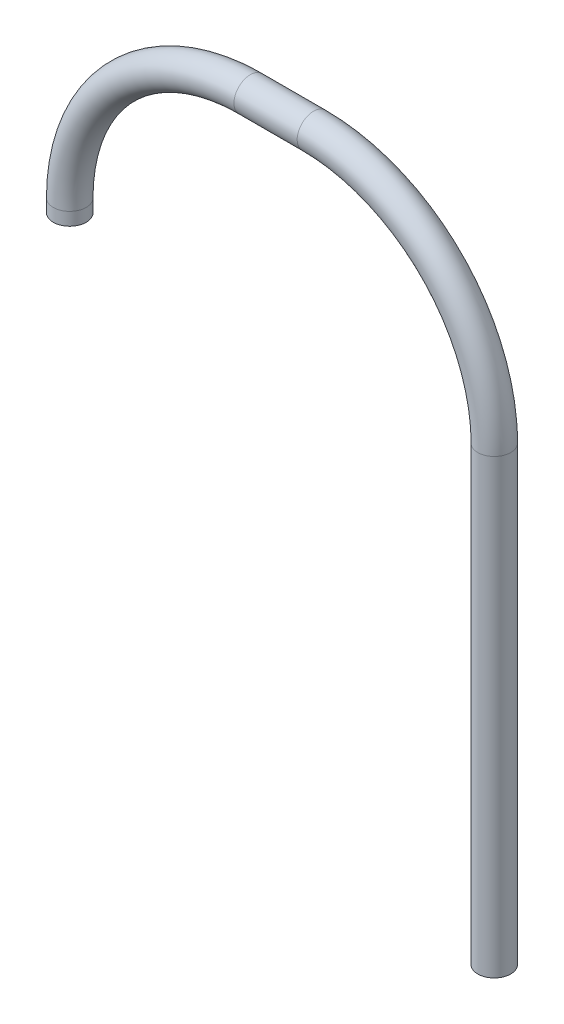
ISO-10303-21;
HEADER;
FILE_DESCRIPTION(('STEP AP214'),'2;1');
FILE_NAME('part.step','',(''),(''),'','','');
FILE_SCHEMA(('AUTOMOTIVE_DESIGN { 1 0 10303 214 1 1 1 1 }'));
ENDSEC;
DATA;
#1=APPLICATION_CONTEXT('core data for automotive mechanical design processes');
#2=APPLICATION_PROTOCOL_DEFINITION('international standard','automotive_design',2000,#1);
#3=PRODUCT_CONTEXT('',#1,'mechanical');
#4=PRODUCT('Part','Part','',(#3));
#5=PRODUCT_RELATED_PRODUCT_CATEGORY('part','',(#4));
#6=PRODUCT_DEFINITION_FORMATION('','',#4);
#7=PRODUCT_DEFINITION_CONTEXT('part definition',#1,'design');
#8=PRODUCT_DEFINITION('design','',#6,#7);
#9=PRODUCT_DEFINITION_SHAPE('','',#8);
#10=(LENGTH_UNIT() NAMED_UNIT(*) SI_UNIT(.MILLI.,.METRE.));
#11=(NAMED_UNIT(*) PLANE_ANGLE_UNIT() SI_UNIT($,.RADIAN.));
#12=(NAMED_UNIT(*) SI_UNIT($,.STERADIAN.) SOLID_ANGLE_UNIT());
#13=UNCERTAINTY_MEASURE_WITH_UNIT(LENGTH_MEASURE(1.E-05),#10,'distance_accuracy_value','');
#14=(GEOMETRIC_REPRESENTATION_CONTEXT(3) GLOBAL_UNCERTAINTY_ASSIGNED_CONTEXT((#13)) GLOBAL_UNIT_ASSIGNED_CONTEXT((#10,
#11,#12)) REPRESENTATION_CONTEXT('',''));
#15=CARTESIAN_POINT('',(0.,0.,0.));
#16=DIRECTION('',(0.,0.,1.));
#17=DIRECTION('',(1.,0.,0.));
#18=AXIS2_PLACEMENT_3D('',#15,#16,#17);
#19=CARTESIAN_POINT('',(-164.463423555775,90.0149049186367,0.));
#20=DIRECTION('',(0.,1.,0.));
#21=DIRECTION('',(0.,0.,1.));
#22=AXIS2_PLACEMENT_3D('',#19,#20,#21);
#23=PLANE('',#22);
#24=CARTESIAN_POINT('',(-164.463423555775,90.0149049186367,0.));
#25=DIRECTION('',(0.,1.,0.));
#26=DIRECTION('',(0.,0.,1.));
#27=AXIS2_PLACEMENT_3D('',#24,#25,#26);
#28=CIRCLE('',#27,12.75);
#29=CARTESIAN_POINT('',(-164.463423555775,90.0149049186367,12.75));
#30=VERTEX_POINT('',#29);
#31=EDGE_CURVE('E18',#30,#30,#28,.T.);
#32=ORIENTED_EDGE('',*,*,#31,.F.);
#33=EDGE_LOOP('',(#32));
#34=FACE_BOUND('',#33,.T.);
#35=ADVANCED_FACE('F15',(#34),#23,.F.);
#36=CARTESIAN_POINT('',(-164.463423555775,90.0149049186367,0.));
#37=DIRECTION('',(0.,1.,0.));
#38=DIRECTION('',(0.,0.,1.));
#39=AXIS2_PLACEMENT_3D('',#36,#37,#38);
#40=CYLINDRICAL_SURFACE('',#39,12.75);
#41=ORIENTED_EDGE('',*,*,#31,.T.);
#42=EDGE_LOOP('',(#41));
#43=FACE_BOUND('',#42,.T.);
#44=CARTESIAN_POINT('',(-164.463423555776,100.014904918637,0.));
#45=DIRECTION('',(0.,1.,0.));
#46=DIRECTION('',(-1.,0.,0.));
#47=AXIS2_PLACEMENT_3D('',#44,#45,#46);
#48=CIRCLE('',#47,12.75);
#49=CARTESIAN_POINT('',(-177.213423555776,100.014904918637,0.));
#50=VERTEX_POINT('',#49);
#51=EDGE_CURVE('E59',#50,#50,#48,.T.);
#52=ORIENTED_EDGE('',*,*,#51,.F.);
#53=EDGE_LOOP('',(#52));
#54=FACE_BOUND('',#53,.T.);
#55=ADVANCED_FACE('F52',(#43,#54),#40,.T.);
#56=CARTESIAN_POINT('',(-24.4634235557755,100.014904918637,0.));
#57=DIRECTION('',(0.,0.,-1.));
#58=DIRECTION('',(-1.,0.,0.));
#59=AXIS2_PLACEMENT_3D('',#56,#57,#58);
#60=TOROIDAL_SURFACE('',#59,140.,12.75);
#61=ORIENTED_EDGE('',*,*,#51,.T.);
#62=EDGE_LOOP('',(#61));
#63=FACE_BOUND('',#62,.T.);
#64=CARTESIAN_POINT('',(-24.4634235557755,240.014904918637,0.));
#65=DIRECTION('',(1.,0.,0.));
#66=DIRECTION('',(0.,0.,-1.));
#67=AXIS2_PLACEMENT_3D('',#64,#65,#66);
#68=CIRCLE('',#67,12.75);
#69=CARTESIAN_POINT('',(-24.4634235557755,240.014904918637,-12.75));
#70=VERTEX_POINT('',#69);
#71=EDGE_CURVE('E62',#70,#70,#68,.T.);
#72=ORIENTED_EDGE('',*,*,#71,.F.);
#73=EDGE_LOOP('',(#72));
#74=FACE_BOUND('',#73,.T.);
#75=ADVANCED_FACE('F48',(#63,#74),#60,.T.);
#76=CARTESIAN_POINT('',(-24.4634235557755,240.014904918637,0.));
#77=DIRECTION('',(1.,0.,0.));
#78=DIRECTION('',(0.,0.,-1.));
#79=AXIS2_PLACEMENT_3D('',#76,#77,#78);
#80=CYLINDRICAL_SURFACE('',#79,12.75);
#81=ORIENTED_EDGE('',*,*,#71,.T.);
#82=EDGE_LOOP('',(#81));
#83=FACE_BOUND('',#82,.T.);
#84=CARTESIAN_POINT('',(24.5365764442245,240.014904918637,0.));
#85=DIRECTION('',(1.,0.,0.));
#86=DIRECTION('',(0.,1.,0.));
#87=AXIS2_PLACEMENT_3D('',#84,#85,#86);
#88=CIRCLE('',#87,12.75);
#89=CARTESIAN_POINT('',(24.5365764442245,252.764904918637,0.));
#90=VERTEX_POINT('',#89);
#91=EDGE_CURVE('E27',#90,#90,#88,.T.);
#92=ORIENTED_EDGE('',*,*,#91,.F.);
#93=EDGE_LOOP('',(#92));
#94=FACE_BOUND('',#93,.T.);
#95=ADVANCED_FACE('F44',(#83,#94),#80,.T.);
#96=CARTESIAN_POINT('',(164.536576444225,-249.985095081363,0.));
#97=DIRECTION('',(0.,-1.,0.));
#98=DIRECTION('',(1.,0.,0.));
#99=AXIS2_PLACEMENT_3D('',#96,#97,#98);
#100=PLANE('',#99);
#101=CARTESIAN_POINT('',(164.536576444225,-249.985095081363,0.));
#102=DIRECTION('',(0.,-1.,0.));
#103=DIRECTION('',(0.,0.,-1.));
#104=AXIS2_PLACEMENT_3D('',#101,#102,#103);
#105=CIRCLE('',#104,12.75);
#106=CARTESIAN_POINT('',(164.536576444225,-249.985095081363,-12.75));
#107=VERTEX_POINT('',#106);
#108=EDGE_CURVE('E22',#107,#107,#105,.F.);
#109=ORIENTED_EDGE('',*,*,#108,.F.);
#110=EDGE_LOOP('',(#109));
#111=FACE_BOUND('',#110,.T.);
#112=ADVANCED_FACE('F40',(#111),#100,.T.);
#113=CARTESIAN_POINT('',(24.5365764442245,100.014904918637,0.));
#114=DIRECTION('',(0.,0.,-1.));
#115=DIRECTION('',(-1.,0.,0.));
#116=AXIS2_PLACEMENT_3D('',#113,#114,#115);
#117=TOROIDAL_SURFACE('',#116,140.,12.75);
#118=ORIENTED_EDGE('',*,*,#91,.T.);
#119=EDGE_LOOP('',(#118));
#120=FACE_BOUND('',#119,.T.);
#121=CARTESIAN_POINT('',(164.536576444225,100.014904918637,0.));
#122=DIRECTION('',(0.,-1.,0.));
#123=DIRECTION('',(0.,0.,-1.));
#124=AXIS2_PLACEMENT_3D('',#121,#122,#123);
#125=CIRCLE('',#124,12.75);
#126=CARTESIAN_POINT('',(164.536576444225,100.014904918637,-12.75));
#127=VERTEX_POINT('',#126);
#128=EDGE_CURVE('E10',#127,#127,#125,.T.);
#129=ORIENTED_EDGE('',*,*,#128,.F.);
#130=EDGE_LOOP('',(#129));
#131=FACE_BOUND('',#130,.T.);
#132=ADVANCED_FACE('F35',(#120,#131),#117,.T.);
#133=CARTESIAN_POINT('',(164.536576444225,100.014904918637,0.));
#134=DIRECTION('',(0.,-1.,0.));
#135=DIRECTION('',(0.,0.,-1.));
#136=AXIS2_PLACEMENT_3D('',#133,#134,#135);
#137=CYLINDRICAL_SURFACE('',#136,12.75);
#138=ORIENTED_EDGE('',*,*,#128,.T.);
#139=EDGE_LOOP('',(#138));
#140=FACE_BOUND('',#139,.T.);
#141=ORIENTED_EDGE('',*,*,#108,.T.);
#142=EDGE_LOOP('',(#141));
#143=FACE_BOUND('',#142,.T.);
#144=ADVANCED_FACE('F39',(#140,#143),#137,.T.);
#145=CLOSED_SHELL('',(#35,#55,#75,#95,#112,#132,#144));
#146=MANIFOLD_SOLID_BREP('B1',#145);
#147=ADVANCED_BREP_SHAPE_REPRESENTATION('',(#18,#146),#14);
#148=SHAPE_DEFINITION_REPRESENTATION(#9,#147);
ENDSEC;
END-ISO-10303-21;
